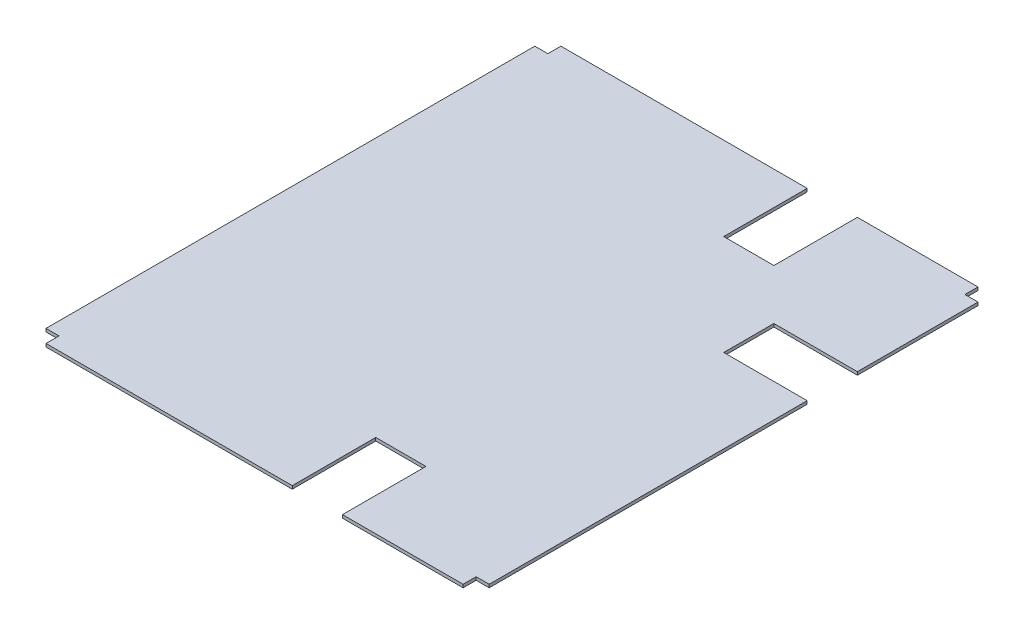
ISO-10303-21;
HEADER;
FILE_DESCRIPTION(('STEP AP214'),'2;1');
FILE_NAME('part.step','',(''),(''),'','','');
FILE_SCHEMA(('AUTOMOTIVE_DESIGN { 1 0 10303 214 1 1 1 1 }'));
ENDSEC;
DATA;
#1=APPLICATION_CONTEXT('core data for automotive mechanical design processes');
#2=APPLICATION_PROTOCOL_DEFINITION('international standard','automotive_design',2000,#1);
#3=PRODUCT_CONTEXT('',#1,'mechanical');
#4=PRODUCT('Part','Part','',(#3));
#5=PRODUCT_RELATED_PRODUCT_CATEGORY('part','',(#4));
#6=PRODUCT_DEFINITION_FORMATION('','',#4);
#7=PRODUCT_DEFINITION_CONTEXT('part definition',#1,'design');
#8=PRODUCT_DEFINITION('design','',#6,#7);
#9=PRODUCT_DEFINITION_SHAPE('','',#8);
#10=(LENGTH_UNIT() NAMED_UNIT(*) SI_UNIT(.MILLI.,.METRE.));
#11=(NAMED_UNIT(*) PLANE_ANGLE_UNIT() SI_UNIT($,.RADIAN.));
#12=(NAMED_UNIT(*) SI_UNIT($,.STERADIAN.) SOLID_ANGLE_UNIT());
#13=UNCERTAINTY_MEASURE_WITH_UNIT(LENGTH_MEASURE(1.E-05),#10,'distance_accuracy_value','');
#14=(GEOMETRIC_REPRESENTATION_CONTEXT(3) GLOBAL_UNCERTAINTY_ASSIGNED_CONTEXT((#13)) GLOBAL_UNIT_ASSIGNED_CONTEXT((#10,
#11,#12)) REPRESENTATION_CONTEXT('',''));
#15=CARTESIAN_POINT('',(0.,0.,0.));
#16=DIRECTION('',(0.,0.,1.));
#17=DIRECTION('',(1.,0.,0.));
#18=AXIS2_PLACEMENT_3D('',#15,#16,#17);
#19=CARTESIAN_POINT('',(-1454.,21.7,1704.));
#20=DIRECTION('',(0.,0.,-1.));
#21=DIRECTION('',(-1.,0.,0.));
#22=AXIS2_PLACEMENT_3D('',#19,#20,#21);
#23=PLANE('',#22);
#24=DIRECTION('',(1.,0.,0.));
#25=VECTOR('',#24,1.);
#26=CARTESIAN_POINT('',(-1454.,0.,1704.));
#27=LINE('',#26,#25);
#28=CARTESIAN_POINT('',(-1545.,0.,1704.));
#29=VERTEX_POINT('',#28);
#30=CARTESIAN_POINT('',(-1454.,0.,1704.));
#31=VERTEX_POINT('',#30);
#32=EDGE_CURVE('E223',#29,#31,#27,.T.);
#33=ORIENTED_EDGE('',*,*,#32,.T.);
#34=DIRECTION('',(0.,-1.,0.));
#35=VECTOR('',#34,1.);
#36=CARTESIAN_POINT('',(-1454.,21.7,1704.));
#37=LINE('',#36,#35);
#38=CARTESIAN_POINT('',(-1454.,21.7,1704.));
#39=VERTEX_POINT('',#38);
#40=EDGE_CURVE('E40',#39,#31,#37,.T.);
#41=ORIENTED_EDGE('',*,*,#40,.F.);
#42=DIRECTION('',(1.,0.,0.));
#43=VECTOR('',#42,1.);
#44=CARTESIAN_POINT('',(-1454.,21.7,1704.));
#45=LINE('',#44,#43);
#46=CARTESIAN_POINT('',(-1545.,21.7,1704.));
#47=VERTEX_POINT('',#46);
#48=EDGE_CURVE('E399',#47,#39,#45,.T.);
#49=ORIENTED_EDGE('',*,*,#48,.F.);
#50=DIRECTION('',(0.,-1.,0.));
#51=VECTOR('',#50,1.);
#52=CARTESIAN_POINT('',(-1545.,21.7,1704.));
#53=LINE('',#52,#51);
#54=EDGE_CURVE('E11',#47,#29,#53,.T.);
#55=ORIENTED_EDGE('',*,*,#54,.T.);
#56=EDGE_LOOP('',(#33,#41,#49,#55));
#57=FACE_BOUND('',#56,.T.);
#58=ADVANCED_FACE('F32',(#57),#23,.F.);
#59=CARTESIAN_POINT('',(-1454.,21.7,1795.));
#60=DIRECTION('',(1.,0.,0.));
#61=DIRECTION('',(0.,0.,-1.));
#62=AXIS2_PLACEMENT_3D('',#59,#60,#61);
#63=PLANE('',#62);
#64=DIRECTION('',(0.,0.,1.));
#65=VECTOR('',#64,1.);
#66=CARTESIAN_POINT('',(-1454.,0.,1795.));
#67=LINE('',#66,#65);
#68=CARTESIAN_POINT('',(-1454.,0.,1795.));
#69=VERTEX_POINT('',#68);
#70=EDGE_CURVE('E225',#31,#69,#67,.T.);
#71=ORIENTED_EDGE('',*,*,#70,.T.);
#72=DIRECTION('',(0.,-1.,0.));
#73=VECTOR('',#72,1.);
#74=CARTESIAN_POINT('',(-1454.,21.7,1795.));
#75=LINE('',#74,#73);
#76=CARTESIAN_POINT('',(-1454.,21.7,1795.));
#77=VERTEX_POINT('',#76);
#78=EDGE_CURVE('E327',#77,#69,#75,.T.);
#79=ORIENTED_EDGE('',*,*,#78,.F.);
#80=DIRECTION('',(0.,0.,1.));
#81=VECTOR('',#80,1.);
#82=CARTESIAN_POINT('',(-1454.,21.7,1795.));
#83=LINE('',#82,#81);
#84=EDGE_CURVE('E336',#39,#77,#83,.T.);
#85=ORIENTED_EDGE('',*,*,#84,.F.);
#86=ORIENTED_EDGE('',*,*,#40,.T.);
#87=EDGE_LOOP('',(#71,#79,#85,#86));
#88=FACE_BOUND('',#87,.T.);
#89=ADVANCED_FACE('F334',(#88),#63,.F.);
#90=CARTESIAN_POINT('',(263.,21.7,1795.));
#91=DIRECTION('',(0.,0.,-1.));
#92=DIRECTION('',(-1.,0.,0.));
#93=AXIS2_PLACEMENT_3D('',#90,#91,#92);
#94=PLANE('',#93);
#95=DIRECTION('',(1.,0.,0.));
#96=VECTOR('',#95,1.);
#97=CARTESIAN_POINT('',(263.,0.,1795.));
#98=LINE('',#97,#96);
#99=CARTESIAN_POINT('',(263.,0.,1795.));
#100=VERTEX_POINT('',#99);
#101=EDGE_CURVE('E228',#69,#100,#98,.T.);
#102=ORIENTED_EDGE('',*,*,#101,.T.);
#103=DIRECTION('',(0.,-1.,0.));
#104=VECTOR('',#103,1.);
#105=CARTESIAN_POINT('',(263.,21.7,1795.));
#106=LINE('',#105,#104);
#107=CARTESIAN_POINT('',(263.,21.7,1795.));
#108=VERTEX_POINT('',#107);
#109=EDGE_CURVE('E324',#108,#100,#106,.T.);
#110=ORIENTED_EDGE('',*,*,#109,.F.);
#111=DIRECTION('',(1.,0.,0.));
#112=VECTOR('',#111,1.);
#113=CARTESIAN_POINT('',(-516.000000000001,21.7,1795.));
#114=LINE('',#113,#112);
#115=EDGE_CURVE('E355',#77,#108,#114,.T.);
#116=ORIENTED_EDGE('',*,*,#115,.F.);
#117=ORIENTED_EDGE('',*,*,#78,.T.);
#118=EDGE_LOOP('',(#102,#110,#116,#117));
#119=FACE_BOUND('',#118,.T.);
#120=ADVANCED_FACE('F346',(#119),#94,.F.);
#121=CARTESIAN_POINT('',(263.,21.7,1213.));
#122=DIRECTION('',(-1.,0.,0.));
#123=DIRECTION('',(0.,0.,1.));
#124=AXIS2_PLACEMENT_3D('',#121,#122,#123);
#125=PLANE('',#124);
#126=DIRECTION('',(0.,0.,-1.));
#127=VECTOR('',#126,1.);
#128=CARTESIAN_POINT('',(263.,0.,1213.));
#129=LINE('',#128,#127);
#130=CARTESIAN_POINT('',(263.,0.,1213.));
#131=VERTEX_POINT('',#130);
#132=EDGE_CURVE('E230',#100,#131,#129,.T.);
#133=ORIENTED_EDGE('',*,*,#132,.T.);
#134=DIRECTION('',(0.,-1.,0.));
#135=VECTOR('',#134,1.);
#136=CARTESIAN_POINT('',(263.,21.7,1213.));
#137=LINE('',#136,#135);
#138=CARTESIAN_POINT('',(263.,21.7,1213.));
#139=VERTEX_POINT('',#138);
#140=EDGE_CURVE('E321',#139,#131,#137,.T.);
#141=ORIENTED_EDGE('',*,*,#140,.F.);
#142=DIRECTION('',(0.,0.,-1.));
#143=VECTOR('',#142,1.);
#144=CARTESIAN_POINT('',(263.,21.7,1213.));
#145=LINE('',#144,#143);
#146=EDGE_CURVE('E352',#108,#139,#145,.T.);
#147=ORIENTED_EDGE('',*,*,#146,.F.);
#148=ORIENTED_EDGE('',*,*,#109,.T.);
#149=EDGE_LOOP('',(#133,#141,#147,#148));
#150=FACE_BOUND('',#149,.T.);
#151=ADVANCED_FACE('F350',(#150),#125,.F.);
#152=CARTESIAN_POINT('',(613.,21.7,1213.));
#153=DIRECTION('',(0.,0.,-1.));
#154=DIRECTION('',(-1.,0.,0.));
#155=AXIS2_PLACEMENT_3D('',#152,#153,#154);
#156=PLANE('',#155);
#157=DIRECTION('',(1.,0.,0.));
#158=VECTOR('',#157,1.);
#159=CARTESIAN_POINT('',(613.,0.,1213.));
#160=LINE('',#159,#158);
#161=CARTESIAN_POINT('',(613.,0.,1213.));
#162=VERTEX_POINT('',#161);
#163=EDGE_CURVE('E233',#131,#162,#160,.T.);
#164=ORIENTED_EDGE('',*,*,#163,.T.);
#165=DIRECTION('',(0.,-1.,0.));
#166=VECTOR('',#165,1.);
#167=CARTESIAN_POINT('',(613.,21.7,1213.));
#168=LINE('',#167,#166);
#169=CARTESIAN_POINT('',(613.,21.7,1213.));
#170=VERTEX_POINT('',#169);
#171=EDGE_CURVE('E318',#170,#162,#168,.T.);
#172=ORIENTED_EDGE('',*,*,#171,.F.);
#173=DIRECTION('',(1.,0.,0.));
#174=VECTOR('',#173,1.);
#175=CARTESIAN_POINT('',(514.,21.7,1213.));
#176=LINE('',#175,#174);
#177=EDGE_CURVE('E354',#139,#170,#176,.T.);
#178=ORIENTED_EDGE('',*,*,#177,.F.);
#179=ORIENTED_EDGE('',*,*,#140,.T.);
#180=EDGE_LOOP('',(#164,#172,#178,#179));
#181=FACE_BOUND('',#180,.T.);
#182=ADVANCED_FACE('F413',(#181),#156,.F.);
#183=CARTESIAN_POINT('',(613.,21.7,1795.));
#184=DIRECTION('',(1.,0.,0.));
#185=DIRECTION('',(0.,0.,-1.));
#186=AXIS2_PLACEMENT_3D('',#183,#184,#185);
#187=PLANE('',#186);
#188=DIRECTION('',(0.,0.,1.));
#189=VECTOR('',#188,1.);
#190=CARTESIAN_POINT('',(613.,0.,1795.));
#191=LINE('',#190,#189);
#192=CARTESIAN_POINT('',(613.,0.,1795.));
#193=VERTEX_POINT('',#192);
#194=EDGE_CURVE('E235',#162,#193,#191,.T.);
#195=ORIENTED_EDGE('',*,*,#194,.T.);
#196=DIRECTION('',(0.,-1.,0.));
#197=VECTOR('',#196,1.);
#198=CARTESIAN_POINT('',(613.,21.7,1795.));
#199=LINE('',#198,#197);
#200=CARTESIAN_POINT('',(613.,21.7,1795.));
#201=VERTEX_POINT('',#200);
#202=EDGE_CURVE('E315',#201,#193,#199,.T.);
#203=ORIENTED_EDGE('',*,*,#202,.F.);
#204=DIRECTION('',(0.,0.,1.));
#205=VECTOR('',#204,1.);
#206=CARTESIAN_POINT('',(613.,21.7,1795.));
#207=LINE('',#206,#205);
#208=EDGE_CURVE('E357',#170,#201,#207,.T.);
#209=ORIENTED_EDGE('',*,*,#208,.F.);
#210=ORIENTED_EDGE('',*,*,#171,.T.);
#211=EDGE_LOOP('',(#195,#203,#209,#210));
#212=FACE_BOUND('',#211,.T.);
#213=ADVANCED_FACE('F416',(#212),#187,.F.);
#214=CARTESIAN_POINT('',(1454.,21.7,1795.));
#215=DIRECTION('',(0.,0.,-1.));
#216=DIRECTION('',(-1.,0.,0.));
#217=AXIS2_PLACEMENT_3D('',#214,#215,#216);
#218=PLANE('',#217);
#219=DIRECTION('',(1.,0.,0.));
#220=VECTOR('',#219,1.);
#221=CARTESIAN_POINT('',(1454.,0.,1795.));
#222=LINE('',#221,#220);
#223=CARTESIAN_POINT('',(1454.,0.,1795.));
#224=VERTEX_POINT('',#223);
#225=EDGE_CURVE('E237',#193,#224,#222,.T.);
#226=ORIENTED_EDGE('',*,*,#225,.T.);
#227=DIRECTION('',(0.,-1.,0.));
#228=VECTOR('',#227,1.);
#229=CARTESIAN_POINT('',(1454.,21.7,1795.));
#230=LINE('',#229,#228);
#231=CARTESIAN_POINT('',(1454.,21.7,1795.));
#232=VERTEX_POINT('',#231);
#233=EDGE_CURVE('E312',#232,#224,#230,.T.);
#234=ORIENTED_EDGE('',*,*,#233,.F.);
#235=DIRECTION('',(1.,0.,0.));
#236=VECTOR('',#235,1.);
#237=CARTESIAN_POINT('',(1454.,21.7,1795.));
#238=LINE('',#237,#236);
#239=EDGE_CURVE('E363',#201,#232,#238,.T.);
#240=ORIENTED_EDGE('',*,*,#239,.F.);
#241=ORIENTED_EDGE('',*,*,#202,.T.);
#242=EDGE_LOOP('',(#226,#234,#240,#241));
#243=FACE_BOUND('',#242,.T.);
#244=ADVANCED_FACE('F420',(#243),#218,.F.);
#245=CARTESIAN_POINT('',(1454.,21.7,1704.));
#246=DIRECTION('',(-1.,0.,0.));
#247=DIRECTION('',(0.,0.,1.));
#248=AXIS2_PLACEMENT_3D('',#245,#246,#247);
#249=PLANE('',#248);
#250=DIRECTION('',(0.,0.,-1.));
#251=VECTOR('',#250,1.);
#252=CARTESIAN_POINT('',(1454.,0.,1704.));
#253=LINE('',#252,#251);
#254=CARTESIAN_POINT('',(1454.,0.,1704.));
#255=VERTEX_POINT('',#254);
#256=EDGE_CURVE('E239',#224,#255,#253,.T.);
#257=ORIENTED_EDGE('',*,*,#256,.T.);
#258=DIRECTION('',(0.,-1.,0.));
#259=VECTOR('',#258,1.);
#260=CARTESIAN_POINT('',(1454.,21.7,1704.));
#261=LINE('',#260,#259);
#262=CARTESIAN_POINT('',(1454.,21.7,1704.));
#263=VERTEX_POINT('',#262);
#264=EDGE_CURVE('E309',#263,#255,#261,.T.);
#265=ORIENTED_EDGE('',*,*,#264,.F.);
#266=DIRECTION('',(0.,0.,-1.));
#267=VECTOR('',#266,1.);
#268=CARTESIAN_POINT('',(1454.,21.7,1704.));
#269=LINE('',#268,#267);
#270=EDGE_CURVE('E365',#232,#263,#269,.T.);
#271=ORIENTED_EDGE('',*,*,#270,.F.);
#272=ORIENTED_EDGE('',*,*,#233,.T.);
#273=EDGE_LOOP('',(#257,#265,#271,#272));
#274=FACE_BOUND('',#273,.T.);
#275=ADVANCED_FACE('F424',(#274),#249,.F.);
#276=CARTESIAN_POINT('',(1545.,21.7,1704.));
#277=DIRECTION('',(0.,0.,-1.));
#278=DIRECTION('',(-1.,0.,0.));
#279=AXIS2_PLACEMENT_3D('',#276,#277,#278);
#280=PLANE('',#279);
#281=DIRECTION('',(1.,0.,0.));
#282=VECTOR('',#281,1.);
#283=CARTESIAN_POINT('',(1545.,0.,1704.));
#284=LINE('',#283,#282);
#285=CARTESIAN_POINT('',(1545.,0.,1704.));
#286=VERTEX_POINT('',#285);
#287=EDGE_CURVE('E241',#255,#286,#284,.T.);
#288=ORIENTED_EDGE('',*,*,#287,.T.);
#289=DIRECTION('',(0.,-1.,0.));
#290=VECTOR('',#289,1.);
#291=CARTESIAN_POINT('',(1545.,21.7,1704.));
#292=LINE('',#291,#290);
#293=CARTESIAN_POINT('',(1545.,21.7,1704.));
#294=VERTEX_POINT('',#293);
#295=EDGE_CURVE('E306',#294,#286,#292,.T.);
#296=ORIENTED_EDGE('',*,*,#295,.F.);
#297=DIRECTION('',(1.,0.,0.));
#298=VECTOR('',#297,1.);
#299=CARTESIAN_POINT('',(1545.,21.7,1704.));
#300=LINE('',#299,#298);
#301=EDGE_CURVE('E367',#263,#294,#300,.T.);
#302=ORIENTED_EDGE('',*,*,#301,.F.);
#303=ORIENTED_EDGE('',*,*,#264,.T.);
#304=EDGE_LOOP('',(#288,#296,#302,#303));
#305=FACE_BOUND('',#304,.T.);
#306=ADVANCED_FACE('F428',(#305),#280,.F.);
#307=CARTESIAN_POINT('',(1545.,21.7,-513.));
#308=DIRECTION('',(-1.,0.,0.));
#309=DIRECTION('',(0.,0.,1.));
#310=AXIS2_PLACEMENT_3D('',#307,#308,#309);
#311=PLANE('',#310);
#312=DIRECTION('',(0.,0.,-1.));
#313=VECTOR('',#312,1.);
#314=CARTESIAN_POINT('',(1545.,0.,-513.));
#315=LINE('',#314,#313);
#316=CARTESIAN_POINT('',(1545.,0.,-513.));
#317=VERTEX_POINT('',#316);
#318=EDGE_CURVE('E244',#286,#317,#315,.T.);
#319=ORIENTED_EDGE('',*,*,#318,.T.);
#320=DIRECTION('',(0.,-1.,0.));
#321=VECTOR('',#320,1.);
#322=CARTESIAN_POINT('',(1545.,21.7,-513.));
#323=LINE('',#322,#321);
#324=CARTESIAN_POINT('',(1545.,21.7,-513.));
#325=VERTEX_POINT('',#324);
#326=EDGE_CURVE('E303',#325,#317,#323,.T.);
#327=ORIENTED_EDGE('',*,*,#326,.F.);
#328=DIRECTION('',(0.,0.,-1.));
#329=VECTOR('',#328,1.);
#330=CARTESIAN_POINT('',(1545.,21.7,1.00000000000044));
#331=LINE('',#330,#329);
#332=EDGE_CURVE('E369',#294,#325,#331,.T.);
#333=ORIENTED_EDGE('',*,*,#332,.F.);
#334=ORIENTED_EDGE('',*,*,#295,.T.);
#335=EDGE_LOOP('',(#319,#327,#333,#334));
#336=FACE_BOUND('',#335,.T.);
#337=ADVANCED_FACE('F432',(#336),#311,.F.);
#338=CARTESIAN_POINT('',(963.,21.7,-513.));
#339=DIRECTION('',(0.,0.,1.));
#340=DIRECTION('',(1.,0.,0.));
#341=AXIS2_PLACEMENT_3D('',#338,#339,#340);
#342=PLANE('',#341);
#343=DIRECTION('',(-1.,0.,0.));
#344=VECTOR('',#343,1.);
#345=CARTESIAN_POINT('',(963.,0.,-513.));
#346=LINE('',#345,#344);
#347=CARTESIAN_POINT('',(963.,0.,-513.));
#348=VERTEX_POINT('',#347);
#349=EDGE_CURVE('E246',#317,#348,#346,.T.);
#350=ORIENTED_EDGE('',*,*,#349,.T.);
#351=DIRECTION('',(0.,-1.,0.));
#352=VECTOR('',#351,1.);
#353=CARTESIAN_POINT('',(963.,21.7,-513.));
#354=LINE('',#353,#352);
#355=CARTESIAN_POINT('',(963.,21.7,-513.));
#356=VERTEX_POINT('',#355);
#357=EDGE_CURVE('E300',#356,#348,#354,.T.);
#358=ORIENTED_EDGE('',*,*,#357,.F.);
#359=DIRECTION('',(-1.,0.,0.));
#360=VECTOR('',#359,1.);
#361=CARTESIAN_POINT('',(963.,21.7,-513.));
#362=LINE('',#361,#360);
#363=EDGE_CURVE('E371',#325,#356,#362,.T.);
#364=ORIENTED_EDGE('',*,*,#363,.F.);
#365=ORIENTED_EDGE('',*,*,#326,.T.);
#366=EDGE_LOOP('',(#350,#358,#364,#365));
#367=FACE_BOUND('',#366,.T.);
#368=ADVANCED_FACE('F436',(#367),#342,.F.);
#369=CARTESIAN_POINT('',(963.,21.7,-863.));
#370=DIRECTION('',(-1.,0.,0.));
#371=DIRECTION('',(0.,0.,1.));
#372=AXIS2_PLACEMENT_3D('',#369,#370,#371);
#373=PLANE('',#372);
#374=DIRECTION('',(0.,0.,-1.));
#375=VECTOR('',#374,1.);
#376=CARTESIAN_POINT('',(963.,0.,-863.));
#377=LINE('',#376,#375);
#378=CARTESIAN_POINT('',(963.,0.,-863.));
#379=VERTEX_POINT('',#378);
#380=EDGE_CURVE('E248',#348,#379,#377,.T.);
#381=ORIENTED_EDGE('',*,*,#380,.T.);
#382=DIRECTION('',(0.,-1.,0.));
#383=VECTOR('',#382,1.);
#384=CARTESIAN_POINT('',(963.,21.7,-863.));
#385=LINE('',#384,#383);
#386=CARTESIAN_POINT('',(963.,21.7,-863.));
#387=VERTEX_POINT('',#386);
#388=EDGE_CURVE('E297',#387,#379,#385,.T.);
#389=ORIENTED_EDGE('',*,*,#388,.F.);
#390=DIRECTION('',(0.,0.,-1.));
#391=VECTOR('',#390,1.);
#392=CARTESIAN_POINT('',(963.,21.7,-863.));
#393=LINE('',#392,#391);
#394=EDGE_CURVE('E373',#356,#387,#393,.T.);
#395=ORIENTED_EDGE('',*,*,#394,.F.);
#396=ORIENTED_EDGE('',*,*,#357,.T.);
#397=EDGE_LOOP('',(#381,#389,#395,#396));
#398=FACE_BOUND('',#397,.T.);
#399=ADVANCED_FACE('F440',(#398),#373,.F.);
#400=CARTESIAN_POINT('',(1545.,21.7,-863.));
#401=DIRECTION('',(0.,0.,-1.));
#402=DIRECTION('',(-1.,0.,0.));
#403=AXIS2_PLACEMENT_3D('',#400,#401,#402);
#404=PLANE('',#403);
#405=DIRECTION('',(1.,0.,0.));
#406=VECTOR('',#405,1.);
#407=CARTESIAN_POINT('',(1545.,0.,-863.));
#408=LINE('',#407,#406);
#409=CARTESIAN_POINT('',(1545.,0.,-863.));
#410=VERTEX_POINT('',#409);
#411=EDGE_CURVE('E250',#379,#410,#408,.T.);
#412=ORIENTED_EDGE('',*,*,#411,.T.);
#413=DIRECTION('',(0.,-1.,0.));
#414=VECTOR('',#413,1.);
#415=CARTESIAN_POINT('',(1545.,21.7,-863.));
#416=LINE('',#415,#414);
#417=CARTESIAN_POINT('',(1545.,21.7,-863.));
#418=VERTEX_POINT('',#417);
#419=EDGE_CURVE('E294',#418,#410,#416,.T.);
#420=ORIENTED_EDGE('',*,*,#419,.F.);
#421=DIRECTION('',(1.,0.,0.));
#422=VECTOR('',#421,1.);
#423=CARTESIAN_POINT('',(1545.,21.7,-863.));
#424=LINE('',#423,#422);
#425=EDGE_CURVE('E375',#387,#418,#424,.T.);
#426=ORIENTED_EDGE('',*,*,#425,.F.);
#427=ORIENTED_EDGE('',*,*,#388,.T.);
#428=EDGE_LOOP('',(#412,#420,#426,#427));
#429=FACE_BOUND('',#428,.T.);
#430=ADVANCED_FACE('F444',(#429),#404,.F.);
#431=CARTESIAN_POINT('',(1545.,21.7,-1704.));
#432=DIRECTION('',(-1.,0.,0.));
#433=DIRECTION('',(0.,0.,1.));
#434=AXIS2_PLACEMENT_3D('',#431,#432,#433);
#435=PLANE('',#434);
#436=DIRECTION('',(0.,0.,-1.));
#437=VECTOR('',#436,1.);
#438=CARTESIAN_POINT('',(1545.,0.,-1704.));
#439=LINE('',#438,#437);
#440=CARTESIAN_POINT('',(1545.,0.,-1704.));
#441=VERTEX_POINT('',#440);
#442=EDGE_CURVE('E252',#410,#441,#439,.T.);
#443=ORIENTED_EDGE('',*,*,#442,.T.);
#444=DIRECTION('',(0.,-1.,0.));
#445=VECTOR('',#444,1.);
#446=CARTESIAN_POINT('',(1545.,21.7,-1704.));
#447=LINE('',#446,#445);
#448=CARTESIAN_POINT('',(1545.,21.7,-1704.));
#449=VERTEX_POINT('',#448);
#450=EDGE_CURVE('E291',#449,#441,#447,.T.);
#451=ORIENTED_EDGE('',*,*,#450,.F.);
#452=DIRECTION('',(0.,0.,-1.));
#453=VECTOR('',#452,1.);
#454=CARTESIAN_POINT('',(1545.,21.7,-1704.));
#455=LINE('',#454,#453);
#456=EDGE_CURVE('E377',#418,#449,#455,.T.);
#457=ORIENTED_EDGE('',*,*,#456,.F.);
#458=ORIENTED_EDGE('',*,*,#419,.T.);
#459=EDGE_LOOP('',(#443,#451,#457,#458));
#460=FACE_BOUND('',#459,.T.);
#461=ADVANCED_FACE('F448',(#460),#435,.F.);
#462=CARTESIAN_POINT('',(1454.,21.7,-1704.));
#463=DIRECTION('',(0.,0.,1.));
#464=DIRECTION('',(1.,0.,0.));
#465=AXIS2_PLACEMENT_3D('',#462,#463,#464);
#466=PLANE('',#465);
#467=DIRECTION('',(-1.,0.,0.));
#468=VECTOR('',#467,1.);
#469=CARTESIAN_POINT('',(1454.,0.,-1704.));
#470=LINE('',#469,#468);
#471=CARTESIAN_POINT('',(1454.,0.,-1704.));
#472=VERTEX_POINT('',#471);
#473=EDGE_CURVE('E254',#441,#472,#470,.T.);
#474=ORIENTED_EDGE('',*,*,#473,.T.);
#475=DIRECTION('',(0.,-1.,0.));
#476=VECTOR('',#475,1.);
#477=CARTESIAN_POINT('',(1454.,21.7,-1704.));
#478=LINE('',#477,#476);
#479=CARTESIAN_POINT('',(1454.,21.7,-1704.));
#480=VERTEX_POINT('',#479);
#481=EDGE_CURVE('E288',#480,#472,#478,.T.);
#482=ORIENTED_EDGE('',*,*,#481,.F.);
#483=DIRECTION('',(-1.,0.,0.));
#484=VECTOR('',#483,1.);
#485=CARTESIAN_POINT('',(1454.,21.7,-1704.));
#486=LINE('',#485,#484);
#487=EDGE_CURVE('E379',#449,#480,#486,.T.);
#488=ORIENTED_EDGE('',*,*,#487,.F.);
#489=ORIENTED_EDGE('',*,*,#450,.T.);
#490=EDGE_LOOP('',(#474,#482,#488,#489));
#491=FACE_BOUND('',#490,.T.);
#492=ADVANCED_FACE('F452',(#491),#466,.F.);
#493=CARTESIAN_POINT('',(1454.,21.7,-1795.));
#494=DIRECTION('',(-1.,0.,0.));
#495=DIRECTION('',(0.,0.,1.));
#496=AXIS2_PLACEMENT_3D('',#493,#494,#495);
#497=PLANE('',#496);
#498=DIRECTION('',(0.,0.,-1.));
#499=VECTOR('',#498,1.);
#500=CARTESIAN_POINT('',(1454.,0.,-1795.));
#501=LINE('',#500,#499);
#502=CARTESIAN_POINT('',(1454.,0.,-1795.));
#503=VERTEX_POINT('',#502);
#504=EDGE_CURVE('E256',#472,#503,#501,.T.);
#505=ORIENTED_EDGE('',*,*,#504,.T.);
#506=DIRECTION('',(0.,-1.,0.));
#507=VECTOR('',#506,1.);
#508=CARTESIAN_POINT('',(1454.,21.7,-1795.));
#509=LINE('',#508,#507);
#510=CARTESIAN_POINT('',(1454.,21.7,-1795.));
#511=VERTEX_POINT('',#510);
#512=EDGE_CURVE('E285',#511,#503,#509,.T.);
#513=ORIENTED_EDGE('',*,*,#512,.F.);
#514=DIRECTION('',(0.,0.,-1.));
#515=VECTOR('',#514,1.);
#516=CARTESIAN_POINT('',(1454.,21.7,-1795.));
#517=LINE('',#516,#515);
#518=EDGE_CURVE('E381',#480,#511,#517,.T.);
#519=ORIENTED_EDGE('',*,*,#518,.F.);
#520=ORIENTED_EDGE('',*,*,#481,.T.);
#521=EDGE_LOOP('',(#505,#513,#519,#520));
#522=FACE_BOUND('',#521,.T.);
#523=ADVANCED_FACE('F456',(#522),#497,.F.);
#524=CARTESIAN_POINT('',(613.,21.7,-1795.));
#525=DIRECTION('',(0.,0.,1.));
#526=DIRECTION('',(1.,0.,0.));
#527=AXIS2_PLACEMENT_3D('',#524,#525,#526);
#528=PLANE('',#527);
#529=DIRECTION('',(-1.,0.,0.));
#530=VECTOR('',#529,1.);
#531=CARTESIAN_POINT('',(613.,0.,-1795.));
#532=LINE('',#531,#530);
#533=CARTESIAN_POINT('',(613.,0.,-1795.));
#534=VERTEX_POINT('',#533);
#535=EDGE_CURVE('E258',#503,#534,#532,.T.);
#536=ORIENTED_EDGE('',*,*,#535,.T.);
#537=DIRECTION('',(0.,-1.,0.));
#538=VECTOR('',#537,1.);
#539=CARTESIAN_POINT('',(613.,21.7,-1795.));
#540=LINE('',#539,#538);
#541=CARTESIAN_POINT('',(613.,21.7,-1795.));
#542=VERTEX_POINT('',#541);
#543=EDGE_CURVE('E282',#542,#534,#540,.T.);
#544=ORIENTED_EDGE('',*,*,#543,.F.);
#545=DIRECTION('',(-1.,0.,0.));
#546=VECTOR('',#545,1.);
#547=CARTESIAN_POINT('',(613.,21.7,-1795.));
#548=LINE('',#547,#546);
#549=EDGE_CURVE('E383',#511,#542,#548,.T.);
#550=ORIENTED_EDGE('',*,*,#549,.F.);
#551=ORIENTED_EDGE('',*,*,#512,.T.);
#552=EDGE_LOOP('',(#536,#544,#550,#551));
#553=FACE_BOUND('',#552,.T.);
#554=ADVANCED_FACE('F460',(#553),#528,.F.);
#555=CARTESIAN_POINT('',(613.,21.7,-1213.));
#556=DIRECTION('',(1.,0.,0.));
#557=DIRECTION('',(0.,0.,-1.));
#558=AXIS2_PLACEMENT_3D('',#555,#556,#557);
#559=PLANE('',#558);
#560=DIRECTION('',(0.,0.,1.));
#561=VECTOR('',#560,1.);
#562=CARTESIAN_POINT('',(613.,0.,-1213.));
#563=LINE('',#562,#561);
#564=CARTESIAN_POINT('',(613.,0.,-1213.));
#565=VERTEX_POINT('',#564);
#566=EDGE_CURVE('E260',#534,#565,#563,.T.);
#567=ORIENTED_EDGE('',*,*,#566,.T.);
#568=DIRECTION('',(0.,-1.,0.));
#569=VECTOR('',#568,1.);
#570=CARTESIAN_POINT('',(613.,21.7,-1213.));
#571=LINE('',#570,#569);
#572=CARTESIAN_POINT('',(613.,21.7,-1213.));
#573=VERTEX_POINT('',#572);
#574=EDGE_CURVE('E279',#573,#565,#571,.T.);
#575=ORIENTED_EDGE('',*,*,#574,.F.);
#576=DIRECTION('',(0.,0.,1.));
#577=VECTOR('',#576,1.);
#578=CARTESIAN_POINT('',(613.,21.7,-1213.));
#579=LINE('',#578,#577);
#580=EDGE_CURVE('E385',#542,#573,#579,.T.);
#581=ORIENTED_EDGE('',*,*,#580,.F.);
#582=ORIENTED_EDGE('',*,*,#543,.T.);
#583=EDGE_LOOP('',(#567,#575,#581,#582));
#584=FACE_BOUND('',#583,.T.);
#585=ADVANCED_FACE('F464',(#584),#559,.F.);
#586=CARTESIAN_POINT('',(263.,21.7,-1213.));
#587=DIRECTION('',(0.,0.,1.));
#588=DIRECTION('',(1.,0.,0.));
#589=AXIS2_PLACEMENT_3D('',#586,#587,#588);
#590=PLANE('',#589);
#591=DIRECTION('',(-1.,0.,0.));
#592=VECTOR('',#591,1.);
#593=CARTESIAN_POINT('',(263.,0.,-1213.));
#594=LINE('',#593,#592);
#595=CARTESIAN_POINT('',(263.,0.,-1213.));
#596=VERTEX_POINT('',#595);
#597=EDGE_CURVE('E263',#565,#596,#594,.T.);
#598=ORIENTED_EDGE('',*,*,#597,.T.);
#599=DIRECTION('',(0.,-1.,0.));
#600=VECTOR('',#599,1.);
#601=CARTESIAN_POINT('',(263.,21.7,-1213.));
#602=LINE('',#601,#600);
#603=CARTESIAN_POINT('',(263.,21.7,-1213.));
#604=VERTEX_POINT('',#603);
#605=EDGE_CURVE('E276',#604,#596,#602,.T.);
#606=ORIENTED_EDGE('',*,*,#605,.F.);
#607=DIRECTION('',(-1.,0.,0.));
#608=VECTOR('',#607,1.);
#609=CARTESIAN_POINT('',(516.,21.7,-1213.));
#610=LINE('',#609,#608);
#611=EDGE_CURVE('E387',#573,#604,#610,.T.);
#612=ORIENTED_EDGE('',*,*,#611,.F.);
#613=ORIENTED_EDGE('',*,*,#574,.T.);
#614=EDGE_LOOP('',(#598,#606,#612,#613));
#615=FACE_BOUND('',#614,.T.);
#616=ADVANCED_FACE('F393',(#615),#590,.F.);
#617=CARTESIAN_POINT('',(263.,21.7,-1795.));
#618=DIRECTION('',(-1.,0.,0.));
#619=DIRECTION('',(0.,0.,1.));
#620=AXIS2_PLACEMENT_3D('',#617,#618,#619);
#621=PLANE('',#620);
#622=DIRECTION('',(0.,0.,-1.));
#623=VECTOR('',#622,1.);
#624=CARTESIAN_POINT('',(263.,0.,-1795.));
#625=LINE('',#624,#623);
#626=CARTESIAN_POINT('',(263.,0.,-1795.));
#627=VERTEX_POINT('',#626);
#628=EDGE_CURVE('E265',#596,#627,#625,.T.);
#629=ORIENTED_EDGE('',*,*,#628,.T.);
#630=DIRECTION('',(0.,-1.,0.));
#631=VECTOR('',#630,1.);
#632=CARTESIAN_POINT('',(263.,21.7,-1795.));
#633=LINE('',#632,#631);
#634=CARTESIAN_POINT('',(263.,21.7,-1795.));
#635=VERTEX_POINT('',#634);
#636=EDGE_CURVE('E212',#635,#627,#633,.T.);
#637=ORIENTED_EDGE('',*,*,#636,.F.);
#638=DIRECTION('',(0.,0.,-1.));
#639=VECTOR('',#638,1.);
#640=CARTESIAN_POINT('',(263.,21.7,-1795.));
#641=LINE('',#640,#639);
#642=EDGE_CURVE('E204',#604,#635,#641,.T.);
#643=ORIENTED_EDGE('',*,*,#642,.F.);
#644=ORIENTED_EDGE('',*,*,#605,.T.);
#645=EDGE_LOOP('',(#629,#637,#643,#644));
#646=FACE_BOUND('',#645,.T.);
#647=ADVANCED_FACE('F396',(#646),#621,.F.);
#648=CARTESIAN_POINT('',(-1454.,21.7,-1795.));
#649=DIRECTION('',(0.,0.,1.));
#650=DIRECTION('',(1.,0.,0.));
#651=AXIS2_PLACEMENT_3D('',#648,#649,#650);
#652=PLANE('',#651);
#653=DIRECTION('',(-1.,0.,0.));
#654=VECTOR('',#653,1.);
#655=CARTESIAN_POINT('',(-1454.,0.,-1795.));
#656=LINE('',#655,#654);
#657=CARTESIAN_POINT('',(-1454.,0.,-1795.));
#658=VERTEX_POINT('',#657);
#659=EDGE_CURVE('E211',#627,#658,#656,.T.);
#660=ORIENTED_EDGE('',*,*,#659,.T.);
#661=DIRECTION('',(0.,-1.,0.));
#662=VECTOR('',#661,1.);
#663=CARTESIAN_POINT('',(-1454.,21.7,-1795.));
#664=LINE('',#663,#662);
#665=CARTESIAN_POINT('',(-1454.,21.7,-1795.));
#666=VERTEX_POINT('',#665);
#667=EDGE_CURVE('E209',#666,#658,#664,.T.);
#668=ORIENTED_EDGE('',*,*,#667,.F.);
#669=DIRECTION('',(-1.,0.,0.));
#670=VECTOR('',#669,1.);
#671=CARTESIAN_POINT('',(-516.000000000001,21.7,-1795.));
#672=LINE('',#671,#670);
#673=EDGE_CURVE('E198',#635,#666,#672,.T.);
#674=ORIENTED_EDGE('',*,*,#673,.F.);
#675=ORIENTED_EDGE('',*,*,#636,.T.);
#676=EDGE_LOOP('',(#660,#668,#674,#675));
#677=FACE_BOUND('',#676,.T.);
#678=ADVANCED_FACE('F210',(#677),#652,.F.);
#679=CARTESIAN_POINT('',(-1454.,21.7,-1704.));
#680=DIRECTION('',(1.,0.,0.));
#681=DIRECTION('',(0.,0.,-1.));
#682=AXIS2_PLACEMENT_3D('',#679,#680,#681);
#683=PLANE('',#682);
#684=DIRECTION('',(0.,0.,1.));
#685=VECTOR('',#684,1.);
#686=CARTESIAN_POINT('',(-1454.,0.,-1704.));
#687=LINE('',#686,#685);
#688=CARTESIAN_POINT('',(-1454.,0.,-1704.));
#689=VERTEX_POINT('',#688);
#690=EDGE_CURVE('E126',#658,#689,#687,.T.);
#691=ORIENTED_EDGE('',*,*,#690,.T.);
#692=DIRECTION('',(0.,-1.,0.));
#693=VECTOR('',#692,1.);
#694=CARTESIAN_POINT('',(-1454.,21.7,-1704.));
#695=LINE('',#694,#693);
#696=CARTESIAN_POINT('',(-1454.,21.7,-1704.));
#697=VERTEX_POINT('',#696);
#698=EDGE_CURVE('E213',#697,#689,#695,.T.);
#699=ORIENTED_EDGE('',*,*,#698,.F.);
#700=DIRECTION('',(0.,0.,1.));
#701=VECTOR('',#700,1.);
#702=CARTESIAN_POINT('',(-1454.,21.7,-1704.));
#703=LINE('',#702,#701);
#704=EDGE_CURVE('E202',#666,#697,#703,.T.);
#705=ORIENTED_EDGE('',*,*,#704,.F.);
#706=ORIENTED_EDGE('',*,*,#667,.T.);
#707=EDGE_LOOP('',(#691,#699,#705,#706));
#708=FACE_BOUND('',#707,.T.);
#709=ADVANCED_FACE('F215',(#708),#683,.F.);
#710=CARTESIAN_POINT('',(-1545.,21.7,-1704.));
#711=DIRECTION('',(0.,0.,1.));
#712=DIRECTION('',(1.,0.,0.));
#713=AXIS2_PLACEMENT_3D('',#710,#711,#712);
#714=PLANE('',#713);
#715=DIRECTION('',(-1.,0.,0.));
#716=VECTOR('',#715,1.);
#717=CARTESIAN_POINT('',(-1545.,0.,-1704.));
#718=LINE('',#717,#716);
#719=CARTESIAN_POINT('',(-1545.,0.,-1704.));
#720=VERTEX_POINT('',#719);
#721=EDGE_CURVE('E133',#689,#720,#718,.T.);
#722=ORIENTED_EDGE('',*,*,#721,.T.);
#723=DIRECTION('',(0.,-1.,0.));
#724=VECTOR('',#723,1.);
#725=CARTESIAN_POINT('',(-1545.,21.7,-1704.));
#726=LINE('',#725,#724);
#727=CARTESIAN_POINT('',(-1545.,21.7,-1704.));
#728=VERTEX_POINT('',#727);
#729=EDGE_CURVE('E219',#728,#720,#726,.T.);
#730=ORIENTED_EDGE('',*,*,#729,.F.);
#731=DIRECTION('',(-1.,0.,0.));
#732=VECTOR('',#731,1.);
#733=CARTESIAN_POINT('',(-1545.,21.7,-1704.));
#734=LINE('',#733,#732);
#735=EDGE_CURVE('E217',#697,#728,#734,.T.);
#736=ORIENTED_EDGE('',*,*,#735,.F.);
#737=ORIENTED_EDGE('',*,*,#698,.T.);
#738=EDGE_LOOP('',(#722,#730,#736,#737));
#739=FACE_BOUND('',#738,.T.);
#740=ADVANCED_FACE('F477',(#739),#714,.F.);
#741=CARTESIAN_POINT('',(-1545.,21.7,-1213.));
#742=DIRECTION('',(1.,0.,0.));
#743=DIRECTION('',(0.,0.,-1.));
#744=AXIS2_PLACEMENT_3D('',#741,#742,#743);
#745=PLANE('',#744);
#746=DIRECTION('',(0.,0.,1.));
#747=VECTOR('',#746,1.);
#748=CARTESIAN_POINT('',(-1545.,0.,-1213.));
#749=LINE('',#748,#747);
#750=EDGE_CURVE('E271',#720,#29,#749,.T.);
#751=ORIENTED_EDGE('',*,*,#750,.T.);
#752=ORIENTED_EDGE('',*,*,#54,.F.);
#753=DIRECTION('',(0.,0.,1.));
#754=VECTOR('',#753,1.);
#755=CARTESIAN_POINT('',(-1545.,21.7,1.00000000000044));
#756=LINE('',#755,#754);
#757=EDGE_CURVE('E48',#728,#47,#756,.T.);
#758=ORIENTED_EDGE('',*,*,#757,.F.);
#759=ORIENTED_EDGE('',*,*,#729,.T.);
#760=EDGE_LOOP('',(#751,#752,#758,#759));
#761=FACE_BOUND('',#760,.T.);
#762=ADVANCED_FACE('F398',(#761),#745,.F.);
#763=CARTESIAN_POINT('',(0.,21.7,0.));
#764=DIRECTION('',(0.,-1.,0.));
#765=DIRECTION('',(0.,0.,-1.));
#766=AXIS2_PLACEMENT_3D('',#763,#764,#765);
#767=PLANE('',#766);
#768=ORIENTED_EDGE('',*,*,#757,.T.);
#769=ORIENTED_EDGE('',*,*,#48,.T.);
#770=ORIENTED_EDGE('',*,*,#84,.T.);
#771=ORIENTED_EDGE('',*,*,#115,.T.);
#772=ORIENTED_EDGE('',*,*,#146,.T.);
#773=ORIENTED_EDGE('',*,*,#177,.T.);
#774=ORIENTED_EDGE('',*,*,#208,.T.);
#775=ORIENTED_EDGE('',*,*,#239,.T.);
#776=ORIENTED_EDGE('',*,*,#270,.T.);
#777=ORIENTED_EDGE('',*,*,#301,.T.);
#778=ORIENTED_EDGE('',*,*,#332,.T.);
#779=ORIENTED_EDGE('',*,*,#363,.T.);
#780=ORIENTED_EDGE('',*,*,#394,.T.);
#781=ORIENTED_EDGE('',*,*,#425,.T.);
#782=ORIENTED_EDGE('',*,*,#456,.T.);
#783=ORIENTED_EDGE('',*,*,#487,.T.);
#784=ORIENTED_EDGE('',*,*,#518,.T.);
#785=ORIENTED_EDGE('',*,*,#549,.T.);
#786=ORIENTED_EDGE('',*,*,#580,.T.);
#787=ORIENTED_EDGE('',*,*,#611,.T.);
#788=ORIENTED_EDGE('',*,*,#642,.T.);
#789=ORIENTED_EDGE('',*,*,#673,.T.);
#790=ORIENTED_EDGE('',*,*,#704,.T.);
#791=ORIENTED_EDGE('',*,*,#735,.T.);
#792=EDGE_LOOP('',(#768,#769,#770,#771,#772,#773,#774,#775,#776,#777,#778,#779,#780,#781,#782,
#783,#784,#785,#786,#787,#788,#789,#790,#791));
#793=FACE_BOUND('',#792,.T.);
#794=ADVANCED_FACE('F200',(#793),#767,.F.);
#795=CARTESIAN_POINT('',(0.,0.,0.));
#796=DIRECTION('',(0.,-1.,0.));
#797=DIRECTION('',(0.,0.,-1.));
#798=AXIS2_PLACEMENT_3D('',#795,#796,#797);
#799=PLANE('',#798);
#800=ORIENTED_EDGE('',*,*,#32,.F.);
#801=ORIENTED_EDGE('',*,*,#750,.F.);
#802=ORIENTED_EDGE('',*,*,#721,.F.);
#803=ORIENTED_EDGE('',*,*,#690,.F.);
#804=ORIENTED_EDGE('',*,*,#659,.F.);
#805=ORIENTED_EDGE('',*,*,#628,.F.);
#806=ORIENTED_EDGE('',*,*,#597,.F.);
#807=ORIENTED_EDGE('',*,*,#566,.F.);
#808=ORIENTED_EDGE('',*,*,#535,.F.);
#809=ORIENTED_EDGE('',*,*,#504,.F.);
#810=ORIENTED_EDGE('',*,*,#473,.F.);
#811=ORIENTED_EDGE('',*,*,#442,.F.);
#812=ORIENTED_EDGE('',*,*,#411,.F.);
#813=ORIENTED_EDGE('',*,*,#380,.F.);
#814=ORIENTED_EDGE('',*,*,#349,.F.);
#815=ORIENTED_EDGE('',*,*,#318,.F.);
#816=ORIENTED_EDGE('',*,*,#287,.F.);
#817=ORIENTED_EDGE('',*,*,#256,.F.);
#818=ORIENTED_EDGE('',*,*,#225,.F.);
#819=ORIENTED_EDGE('',*,*,#194,.F.);
#820=ORIENTED_EDGE('',*,*,#163,.F.);
#821=ORIENTED_EDGE('',*,*,#132,.F.);
#822=ORIENTED_EDGE('',*,*,#101,.F.);
#823=ORIENTED_EDGE('',*,*,#70,.F.);
#824=EDGE_LOOP('',(#800,#801,#802,#803,#804,#805,#806,#807,#808,#809,#810,#811,#812,#813,#814,
#815,#816,#817,#818,#819,#820,#821,#822,#823));
#825=FACE_BOUND('',#824,.T.);
#826=ADVANCED_FACE('F341',(#825),#799,.T.);
#827=CLOSED_SHELL('',(#58,#89,#120,#151,#182,#213,#244,#275,#306,#337,#368,#399,#430,#461,#492,
#523,#554,#585,#616,#647,#678,#709,#740,#762,#794,#826));
#828=MANIFOLD_SOLID_BREP('B2',#827);
#829=ADVANCED_BREP_SHAPE_REPRESENTATION('',(#18,#828),#14);
#830=SHAPE_DEFINITION_REPRESENTATION(#9,#829);
ENDSEC;
END-ISO-10303-21;
